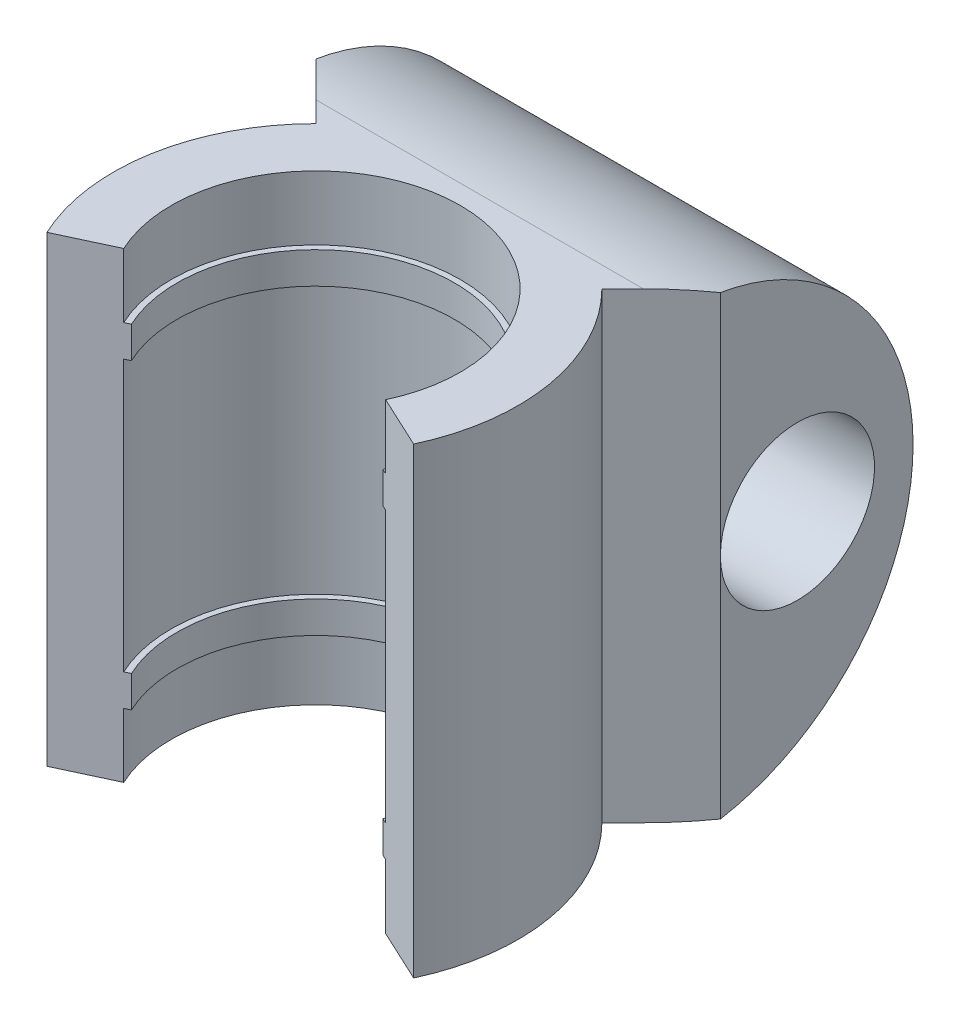
ISO-10303-21;
HEADER;
FILE_DESCRIPTION(('STEP AP214'),'2;1');
FILE_NAME('part.step','',(''),(''),'','','');
FILE_SCHEMA(('AUTOMOTIVE_DESIGN { 1 0 10303 214 1 1 1 1 }'));
ENDSEC;
DATA;
#1=APPLICATION_CONTEXT('core data for automotive mechanical design processes');
#2=APPLICATION_PROTOCOL_DEFINITION('international standard','automotive_design',2000,#1);
#3=PRODUCT_CONTEXT('',#1,'mechanical');
#4=PRODUCT('Part','Part','',(#3));
#5=PRODUCT_RELATED_PRODUCT_CATEGORY('part','',(#4));
#6=PRODUCT_DEFINITION_FORMATION('','',#4);
#7=PRODUCT_DEFINITION_CONTEXT('part definition',#1,'design');
#8=PRODUCT_DEFINITION('design','',#6,#7);
#9=PRODUCT_DEFINITION_SHAPE('','',#8);
#10=(LENGTH_UNIT() NAMED_UNIT(*) SI_UNIT(.MILLI.,.METRE.));
#11=(NAMED_UNIT(*) PLANE_ANGLE_UNIT() SI_UNIT($,.RADIAN.));
#12=(NAMED_UNIT(*) SI_UNIT($,.STERADIAN.) SOLID_ANGLE_UNIT());
#13=UNCERTAINTY_MEASURE_WITH_UNIT(LENGTH_MEASURE(1.E-05),#10,'distance_accuracy_value','');
#14=(GEOMETRIC_REPRESENTATION_CONTEXT(3) GLOBAL_UNCERTAINTY_ASSIGNED_CONTEXT((#13)) GLOBAL_UNIT_ASSIGNED_CONTEXT((#10,
#11,#12)) REPRESENTATION_CONTEXT('',''));
#15=CARTESIAN_POINT('',(0.,0.,0.));
#16=DIRECTION('',(0.,0.,1.));
#17=DIRECTION('',(1.,0.,0.));
#18=AXIS2_PLACEMENT_3D('',#15,#16,#17);
#19=CARTESIAN_POINT('',(0.,-542.901644973638,-1.86228782416426E-12));
#20=DIRECTION('',(0.,-1.,0.));
#21=DIRECTION('',(0.,0.,-1.));
#22=AXIS2_PLACEMENT_3D('',#19,#20,#21);
#23=CYLINDRICAL_SURFACE('',#22,10.5);
#24=CARTESIAN_POINT('',(0.,0.,0.));
#25=DIRECTION('',(0.,-1.,0.));
#26=DIRECTION('',(0.,0.,-1.));
#27=AXIS2_PLACEMENT_3D('',#24,#25,#26);
#28=CIRCLE('',#27,10.5);
#29=CARTESIAN_POINT('',(7.42462120245875,0.,-7.42462120245875));
#30=VERTEX_POINT('',#29);
#31=CARTESIAN_POINT('',(9.51623176388481,0.,4.43749174827739));
#32=VERTEX_POINT('',#31);
#33=EDGE_CURVE('E214',#30,#32,#28,.T.);
#34=ORIENTED_EDGE('',*,*,#33,.F.);
#35=DIRECTION('',(0.,1.,0.));
#36=VECTOR('',#35,1.);
#37=CARTESIAN_POINT('',(7.42462120245881,-24.737937074445,-7.42462120245889));
#38=LINE('',#37,#36);
#39=CARTESIAN_POINT('',(7.42462120245881,24.,-7.42462120245873));
#40=VERTEX_POINT('',#39);
#41=EDGE_CURVE('E206',#30,#40,#38,.T.);
#42=ORIENTED_EDGE('',*,*,#41,.T.);
#43=CARTESIAN_POINT('',(0.,23.9999999999999,0.));
#44=DIRECTION('',(0.,-1.,0.));
#45=DIRECTION('',(0.,0.,-1.));
#46=AXIS2_PLACEMENT_3D('',#43,#44,#45);
#47=CIRCLE('',#46,10.5000000000001);
#48=CARTESIAN_POINT('',(9.51623176388488,23.9999999999999,4.4374917482775));
#49=VERTEX_POINT('',#48);
#50=EDGE_CURVE('E213',#40,#49,#47,.T.);
#51=ORIENTED_EDGE('',*,*,#50,.T.);
#52=DIRECTION('',(0.,1.,0.));
#53=VECTOR('',#52,1.);
#54=CARTESIAN_POINT('',(9.51623176388481,0.,4.43749174827739));
#55=LINE('',#54,#53);
#56=EDGE_CURVE('E332',#32,#49,#55,.T.);
#57=ORIENTED_EDGE('',*,*,#56,.F.);
#58=EDGE_LOOP('',(#34,#42,#51,#57));
#59=FACE_BOUND('',#58,.T.);
#60=ADVANCED_FACE('F47',(#59),#23,.T.);
#61=CARTESIAN_POINT('',(0.,19.03,0.));
#62=DIRECTION('',(0.,1.,0.));
#63=DIRECTION('',(0.,0.,1.));
#64=AXIS2_PLACEMENT_3D('',#61,#62,#63);
#65=PLANE('',#64);
#66=CARTESIAN_POINT('',(0.,19.03,0.));
#67=DIRECTION('',(0.,-1.,0.));
#68=DIRECTION('',(0.,0.,-1.));
#69=AXIS2_PLACEMENT_3D('',#66,#67,#68);
#70=CIRCLE('',#69,7.20000000000007);
#71=CARTESIAN_POINT('',(-6.52541606666392,19.03,3.04285148453316));
#72=VERTEX_POINT('',#71);
#73=CARTESIAN_POINT('',(6.52541606666392,19.03,3.04285148453316));
#74=VERTEX_POINT('',#73);
#75=EDGE_CURVE('E233',#72,#74,#70,.T.);
#76=ORIENTED_EDGE('',*,*,#75,.F.);
#77=DIRECTION('',(0.906307787036648,0.,-0.422618261740703));
#78=VECTOR('',#77,1.);
#79=CARTESIAN_POINT('',(0.,19.03,0.));
#80=LINE('',#79,#78);
#81=CARTESIAN_POINT('',(-6.79730840277492,19.03,3.16963696305537));
#82=VERTEX_POINT('',#81);
#83=EDGE_CURVE('E352',#82,#72,#80,.T.);
#84=ORIENTED_EDGE('',*,*,#83,.F.);
#85=CARTESIAN_POINT('',(0.,19.03,0.));
#86=DIRECTION('',(0.,-1.,0.));
#87=DIRECTION('',(0.,0.,-1.));
#88=AXIS2_PLACEMENT_3D('',#85,#86,#87);
#89=CIRCLE('',#88,7.50000000000006);
#90=CARTESIAN_POINT('',(6.79730840277492,19.03,3.16963696305537));
#91=VERTEX_POINT('',#90);
#92=EDGE_CURVE('E397',#82,#91,#89,.T.);
#93=ORIENTED_EDGE('',*,*,#92,.T.);
#94=DIRECTION('',(-0.906307787036648,0.,-0.422618261740703));
#95=VECTOR('',#94,1.);
#96=CARTESIAN_POINT('',(0.,19.03,0.));
#97=LINE('',#96,#95);
#98=EDGE_CURVE('E304',#91,#74,#97,.T.);
#99=ORIENTED_EDGE('',*,*,#98,.T.);
#100=EDGE_LOOP('',(#76,#84,#93,#99));
#101=FACE_BOUND('',#100,.T.);
#102=ADVANCED_FACE('F447',(#101),#65,.F.);
#103=CARTESIAN_POINT('',(0.,-542.901644973638,-1.86228782416426E-12));
#104=DIRECTION('',(0.,-1.,0.));
#105=DIRECTION('',(0.,0.,-1.));
#106=AXIS2_PLACEMENT_3D('',#103,#104,#105);
#107=CYLINDRICAL_SURFACE('',#106,7.20000000000007);
#108=CARTESIAN_POINT('',(0.,20.67,0.));
#109=DIRECTION('',(0.,-1.,0.));
#110=DIRECTION('',(0.,0.,-1.));
#111=AXIS2_PLACEMENT_3D('',#108,#109,#110);
#112=CIRCLE('',#111,7.20000000000007);
#113=CARTESIAN_POINT('',(-6.52541606666393,20.67,3.04285148453316));
#114=VERTEX_POINT('',#113);
#115=CARTESIAN_POINT('',(6.52541606666393,20.67,3.04285148453316));
#116=VERTEX_POINT('',#115);
#117=EDGE_CURVE('E230',#114,#116,#112,.T.);
#118=ORIENTED_EDGE('',*,*,#117,.F.);
#119=DIRECTION('',(0.,-1.,0.));
#120=VECTOR('',#119,1.);
#121=CARTESIAN_POINT('',(-6.52541606666387,0.,3.04285148453306));
#122=LINE('',#121,#120);
#123=EDGE_CURVE('E393',#114,#72,#122,.T.);
#124=ORIENTED_EDGE('',*,*,#123,.T.);
#125=ORIENTED_EDGE('',*,*,#75,.T.);
#126=DIRECTION('',(0.,-1.,0.));
#127=VECTOR('',#126,1.);
#128=CARTESIAN_POINT('',(6.52541606666387,0.,3.04285148453306));
#129=LINE('',#128,#127);
#130=EDGE_CURVE('E348',#116,#74,#129,.T.);
#131=ORIENTED_EDGE('',*,*,#130,.F.);
#132=EDGE_LOOP('',(#118,#124,#125,#131));
#133=FACE_BOUND('',#132,.T.);
#134=ADVANCED_FACE('F445',(#133),#107,.F.);
#135=CARTESIAN_POINT('',(-2.80908414487774E-13,20.67,2.01892991722799E-13));
#136=DIRECTION('',(0.,1.,0.));
#137=DIRECTION('',(0.,0.,1.));
#138=AXIS2_PLACEMENT_3D('',#135,#136,#137);
#139=PLANE('',#138);
#140=CARTESIAN_POINT('',(0.,20.67,0.));
#141=DIRECTION('',(0.,-1.,0.));
#142=DIRECTION('',(0.,0.,-1.));
#143=AXIS2_PLACEMENT_3D('',#140,#141,#142);
#144=CIRCLE('',#143,7.50000000000007);
#145=CARTESIAN_POINT('',(-6.79730840277492,20.67,3.16963696305538));
#146=VERTEX_POINT('',#145);
#147=CARTESIAN_POINT('',(6.79730840277493,20.67,3.16963696305538));
#148=VERTEX_POINT('',#147);
#149=EDGE_CURVE('E227',#146,#148,#144,.T.);
#150=ORIENTED_EDGE('',*,*,#149,.F.);
#151=DIRECTION('',(0.906307787036648,0.,-0.422618261740703));
#152=VECTOR('',#151,1.);
#153=CARTESIAN_POINT('',(-2.80908414487774E-13,20.6700000000001,2.01892991722799E-13));
#154=LINE('',#153,#152);
#155=EDGE_CURVE('E389',#146,#114,#154,.T.);
#156=ORIENTED_EDGE('',*,*,#155,.T.);
#157=ORIENTED_EDGE('',*,*,#117,.T.);
#158=DIRECTION('',(-0.906307787036648,0.,-0.422618261740703));
#159=VECTOR('',#158,1.);
#160=CARTESIAN_POINT('',(2.80908414487774E-13,20.6700000000001,2.01892991722798E-13));
#161=LINE('',#160,#159);
#162=EDGE_CURVE('E344',#148,#116,#161,.T.);
#163=ORIENTED_EDGE('',*,*,#162,.F.);
#164=EDGE_LOOP('',(#150,#156,#157,#163));
#165=FACE_BOUND('',#164,.T.);
#166=ADVANCED_FACE('F442',(#165),#139,.T.);
#167=CARTESIAN_POINT('',(0.,-542.901644973638,-1.86228782416426E-12));
#168=DIRECTION('',(0.,-1.,0.));
#169=DIRECTION('',(0.,0.,-1.));
#170=AXIS2_PLACEMENT_3D('',#167,#168,#169);
#171=CYLINDRICAL_SURFACE('',#170,7.50000000000008);
#172=CARTESIAN_POINT('',(0.,23.9999999999999,0.));
#173=DIRECTION('',(0.,-1.,0.));
#174=DIRECTION('',(0.,0.,-1.));
#175=AXIS2_PLACEMENT_3D('',#172,#173,#174);
#176=CIRCLE('',#175,7.50000000000008);
#177=CARTESIAN_POINT('',(-6.79730840277494,24.,3.16963696305539));
#178=VERTEX_POINT('',#177);
#179=CARTESIAN_POINT('',(6.79730840277494,24.,3.16963696305539));
#180=VERTEX_POINT('',#179);
#181=EDGE_CURVE('E224',#178,#180,#176,.T.);
#182=ORIENTED_EDGE('',*,*,#181,.F.);
#183=DIRECTION('',(0.,-1.,0.));
#184=VECTOR('',#183,1.);
#185=CARTESIAN_POINT('',(-6.79730840277486,0.,3.16963696305528));
#186=LINE('',#185,#184);
#187=EDGE_CURVE('E385',#178,#146,#186,.T.);
#188=ORIENTED_EDGE('',*,*,#187,.T.);
#189=ORIENTED_EDGE('',*,*,#149,.T.);
#190=DIRECTION('',(0.,-1.,0.));
#191=VECTOR('',#190,1.);
#192=CARTESIAN_POINT('',(6.79730840277486,0.,3.16963696305527));
#193=LINE('',#192,#191);
#194=EDGE_CURVE('E340',#180,#148,#193,.T.);
#195=ORIENTED_EDGE('',*,*,#194,.F.);
#196=EDGE_LOOP('',(#182,#188,#189,#195));
#197=FACE_BOUND('',#196,.T.);
#198=ADVANCED_FACE('F437',(#197),#171,.F.);
#199=CARTESIAN_POINT('',(0.,24.,1.17118436835184E-13));
#200=DIRECTION('',(0.,-1.,0.));
#201=DIRECTION('',(0.,0.,-1.));
#202=AXIS2_PLACEMENT_3D('',#199,#200,#201);
#203=PLANE('',#202);
#204=DIRECTION('',(-0.707106781186547,0.,0.707106781186548));
#205=VECTOR('',#204,1.);
#206=CARTESIAN_POINT('',(0.,24.,0.));
#207=LINE('',#206,#205);
#208=CARTESIAN_POINT('',(8.50000000000009,24.,-8.5));
#209=VERTEX_POINT('',#208);
#210=EDGE_CURVE('E288',#209,#40,#207,.T.);
#211=ORIENTED_EDGE('',*,*,#210,.F.);
#212=DIRECTION('',(-1.,0.,0.));
#213=VECTOR('',#212,1.);
#214=CARTESIAN_POINT('',(-10.5000000000001,24.,-8.5));
#215=LINE('',#214,#213);
#216=CARTESIAN_POINT('',(-8.50000000000009,24.,-8.50000000000001));
#217=VERTEX_POINT('',#216);
#218=EDGE_CURVE('E11',#209,#217,#215,.T.);
#219=ORIENTED_EDGE('',*,*,#218,.T.);
#220=DIRECTION('',(0.707106781186547,0.,0.707106781186548));
#221=VECTOR('',#220,1.);
#222=CARTESIAN_POINT('',(0.,24.,0.));
#223=LINE('',#222,#221);
#224=CARTESIAN_POINT('',(-7.42462120245881,24.,-7.42462120245873));
#225=VERTEX_POINT('',#224);
#226=EDGE_CURVE('E197',#217,#225,#223,.T.);
#227=ORIENTED_EDGE('',*,*,#226,.T.);
#228=CARTESIAN_POINT('',(-9.51623176388488,23.9999999999999,4.4374917482775));
#229=VERTEX_POINT('',#228);
#230=EDGE_CURVE('E204',#229,#225,#47,.T.);
#231=ORIENTED_EDGE('',*,*,#230,.F.);
#232=DIRECTION('',(-0.906307787036648,0.,0.422618261740703));
#233=VECTOR('',#232,1.);
#234=CARTESIAN_POINT('',(0.,24.,1.17118436835184E-13));
#235=LINE('',#234,#233);
#236=EDGE_CURVE('E381',#178,#229,#235,.T.);
#237=ORIENTED_EDGE('',*,*,#236,.F.);
#238=ORIENTED_EDGE('',*,*,#181,.T.);
#239=DIRECTION('',(0.906307787036648,0.,0.422618261740703));
#240=VECTOR('',#239,1.);
#241=CARTESIAN_POINT('',(0.,24.,1.17118436835184E-13));
#242=LINE('',#241,#240);
#243=EDGE_CURVE('E336',#180,#49,#242,.T.);
#244=ORIENTED_EDGE('',*,*,#243,.T.);
#245=ORIENTED_EDGE('',*,*,#50,.F.);
#246=EDGE_LOOP('',(#211,#219,#227,#231,#237,#238,#244,#245));
#247=FACE_BOUND('',#246,.T.);
#248=ADVANCED_FACE('F433',(#247),#203,.F.);
#249=DIRECTION('',(0.,1.,0.));
#250=VECTOR('',#249,1.);
#251=CARTESIAN_POINT('',(-7.42462120245881,-24.737937074445,-7.42462120245889));
#252=LINE('',#251,#250);
#253=CARTESIAN_POINT('',(-7.42462120245881,0.,-7.42462120245881));
#254=VERTEX_POINT('',#253);
#255=EDGE_CURVE('E188',#254,#225,#252,.T.);
#256=ORIENTED_EDGE('',*,*,#255,.F.);
#257=CARTESIAN_POINT('',(-9.51623176388481,0.,4.43749174827739));
#258=VERTEX_POINT('',#257);
#259=EDGE_CURVE('E202',#258,#254,#28,.T.);
#260=ORIENTED_EDGE('',*,*,#259,.F.);
#261=DIRECTION('',(0.,1.,0.));
#262=VECTOR('',#261,1.);
#263=CARTESIAN_POINT('',(-9.51623176388481,0.,4.43749174827739));
#264=LINE('',#263,#262);
#265=EDGE_CURVE('E378',#258,#229,#264,.T.);
#266=ORIENTED_EDGE('',*,*,#265,.T.);
#267=ORIENTED_EDGE('',*,*,#230,.T.);
#268=EDGE_LOOP('',(#256,#260,#266,#267));
#269=FACE_BOUND('',#268,.T.);
#270=ADVANCED_FACE('F200',(#269),#23,.T.);
#271=CARTESIAN_POINT('',(0.,0.,0.));
#272=DIRECTION('',(0.,-1.,0.));
#273=DIRECTION('',(0.,0.,-1.));
#274=AXIS2_PLACEMENT_3D('',#271,#272,#273);
#275=PLANE('',#274);
#276=DIRECTION('',(0.707106781186547,0.,0.707106781186548));
#277=VECTOR('',#276,1.);
#278=CARTESIAN_POINT('',(0.,0.,0.));
#279=LINE('',#278,#277);
#280=CARTESIAN_POINT('',(-8.50000000000009,0.,-8.50000000000009));
#281=VERTEX_POINT('',#280);
#282=EDGE_CURVE('E183',#281,#254,#279,.T.);
#283=ORIENTED_EDGE('',*,*,#282,.F.);
#284=DIRECTION('',(-1.,0.,0.));
#285=VECTOR('',#284,1.);
#286=CARTESIAN_POINT('',(0.,0.,-8.50000000000009));
#287=LINE('',#286,#285);
#288=CARTESIAN_POINT('',(8.50000000000009,0.,-8.50000000000009));
#289=VERTEX_POINT('',#288);
#290=EDGE_CURVE('E248',#281,#289,#287,.F.);
#291=ORIENTED_EDGE('',*,*,#290,.T.);
#292=DIRECTION('',(-0.707106781186547,0.,0.707106781186548));
#293=VECTOR('',#292,1.);
#294=CARTESIAN_POINT('',(0.,0.,0.));
#295=LINE('',#294,#293);
#296=EDGE_CURVE('E280',#289,#30,#295,.T.);
#297=ORIENTED_EDGE('',*,*,#296,.T.);
#298=ORIENTED_EDGE('',*,*,#33,.T.);
#299=DIRECTION('',(0.906307787036648,0.,0.422618261740703));
#300=VECTOR('',#299,1.);
#301=CARTESIAN_POINT('',(0.,0.,0.));
#302=LINE('',#301,#300);
#303=CARTESIAN_POINT('',(6.79730840277486,0.,3.16963696305528));
#304=VERTEX_POINT('',#303);
#305=EDGE_CURVE('E328',#304,#32,#302,.T.);
#306=ORIENTED_EDGE('',*,*,#305,.F.);
#307=CARTESIAN_POINT('',(0.,0.,0.));
#308=DIRECTION('',(0.,-1.,0.));
#309=DIRECTION('',(0.,0.,-1.));
#310=AXIS2_PLACEMENT_3D('',#307,#308,#309);
#311=CIRCLE('',#310,7.5);
#312=CARTESIAN_POINT('',(-6.79730840277486,0.,3.16963696305528));
#313=VERTEX_POINT('',#312);
#314=EDGE_CURVE('E219',#313,#304,#311,.T.);
#315=ORIENTED_EDGE('',*,*,#314,.F.);
#316=DIRECTION('',(-0.906307787036648,0.,0.422618261740703));
#317=VECTOR('',#316,1.);
#318=CARTESIAN_POINT('',(0.,0.,0.));
#319=LINE('',#318,#317);
#320=EDGE_CURVE('E210',#313,#258,#319,.T.);
#321=ORIENTED_EDGE('',*,*,#320,.T.);
#322=ORIENTED_EDGE('',*,*,#259,.T.);
#323=EDGE_LOOP('',(#283,#291,#297,#298,#306,#315,#321,#322));
#324=FACE_BOUND('',#323,.T.);
#325=ADVANCED_FACE('F208',(#324),#275,.T.);
#326=CARTESIAN_POINT('',(0.,-542.901644973638,-1.86228782416426E-12));
#327=DIRECTION('',(0.,-1.,0.));
#328=DIRECTION('',(0.,0.,-1.));
#329=AXIS2_PLACEMENT_3D('',#326,#327,#328);
#330=CYLINDRICAL_SURFACE('',#329,7.50000000000001);
#331=CARTESIAN_POINT('',(0.,3.32999999999994,0.));
#332=DIRECTION('',(0.,-1.,0.));
#333=DIRECTION('',(0.,0.,-1.));
#334=AXIS2_PLACEMENT_3D('',#331,#332,#333);
#335=CIRCLE('',#334,7.50000000000001);
#336=CARTESIAN_POINT('',(-6.79730840277487,3.32999999999996,3.16963696305529));
#337=VERTEX_POINT('',#336);
#338=CARTESIAN_POINT('',(6.79730840277487,3.32999999999996,3.16963696305529));
#339=VERTEX_POINT('',#338);
#340=EDGE_CURVE('E408',#337,#339,#335,.T.);
#341=ORIENTED_EDGE('',*,*,#340,.F.);
#342=DIRECTION('',(0.,-1.,0.));
#343=VECTOR('',#342,1.);
#344=CARTESIAN_POINT('',(-6.79730840277486,0.,3.16963696305528));
#345=LINE('',#344,#343);
#346=EDGE_CURVE('E372',#337,#313,#345,.T.);
#347=ORIENTED_EDGE('',*,*,#346,.T.);
#348=ORIENTED_EDGE('',*,*,#314,.T.);
#349=DIRECTION('',(0.,-1.,0.));
#350=VECTOR('',#349,1.);
#351=CARTESIAN_POINT('',(6.79730840277486,0.,3.16963696305528));
#352=LINE('',#351,#350);
#353=EDGE_CURVE('E324',#339,#304,#352,.T.);
#354=ORIENTED_EDGE('',*,*,#353,.F.);
#355=EDGE_LOOP('',(#341,#347,#348,#354));
#356=FACE_BOUND('',#355,.T.);
#357=ADVANCED_FACE('F416',(#356),#330,.F.);
#358=CARTESIAN_POINT('',(0.,3.32999999999997,0.));
#359=DIRECTION('',(0.,1.,0.));
#360=DIRECTION('',(0.,0.,1.));
#361=AXIS2_PLACEMENT_3D('',#358,#359,#360);
#362=PLANE('',#361);
#363=CARTESIAN_POINT('',(0.,3.32999999999994,0.));
#364=DIRECTION('',(0.,-1.,0.));
#365=DIRECTION('',(0.,0.,-1.));
#366=AXIS2_PLACEMENT_3D('',#363,#364,#365);
#367=CIRCLE('',#366,7.20000000000001);
#368=CARTESIAN_POINT('',(-6.52541606666388,3.32999999999996,3.04285148453308));
#369=VERTEX_POINT('',#368);
#370=CARTESIAN_POINT('',(6.52541606666388,3.32999999999996,3.04285148453308));
#371=VERTEX_POINT('',#370);
#372=EDGE_CURVE('E406',#369,#371,#367,.T.);
#373=ORIENTED_EDGE('',*,*,#372,.F.);
#374=DIRECTION('',(0.906307787036648,0.,-0.422618261740703));
#375=VECTOR('',#374,1.);
#376=CARTESIAN_POINT('',(0.,3.33,0.));
#377=LINE('',#376,#375);
#378=EDGE_CURVE('E368',#337,#369,#377,.T.);
#379=ORIENTED_EDGE('',*,*,#378,.F.);
#380=ORIENTED_EDGE('',*,*,#340,.T.);
#381=DIRECTION('',(-0.906307787036648,0.,-0.422618261740703));
#382=VECTOR('',#381,1.);
#383=CARTESIAN_POINT('',(0.,3.33,0.));
#384=LINE('',#383,#382);
#385=EDGE_CURVE('E320',#339,#371,#384,.T.);
#386=ORIENTED_EDGE('',*,*,#385,.T.);
#387=EDGE_LOOP('',(#373,#379,#380,#386));
#388=FACE_BOUND('',#387,.T.);
#389=ADVANCED_FACE('F460',(#388),#362,.F.);
#390=CARTESIAN_POINT('',(0.,-542.901644973638,-1.86228782416426E-12));
#391=DIRECTION('',(0.,-1.,0.));
#392=DIRECTION('',(0.,0.,-1.));
#393=AXIS2_PLACEMENT_3D('',#390,#391,#392);
#394=CYLINDRICAL_SURFACE('',#393,7.20000000000002);
#395=CARTESIAN_POINT('',(0.,4.96999999999992,0.));
#396=DIRECTION('',(0.,-1.,0.));
#397=DIRECTION('',(0.,0.,-1.));
#398=AXIS2_PLACEMENT_3D('',#395,#396,#397);
#399=CIRCLE('',#398,7.20000000000002);
#400=CARTESIAN_POINT('',(-6.52541606666388,4.96999999999996,3.04285148453309));
#401=VERTEX_POINT('',#400);
#402=CARTESIAN_POINT('',(6.52541606666388,4.96999999999996,3.04285148453309));
#403=VERTEX_POINT('',#402);
#404=EDGE_CURVE('E403',#401,#403,#399,.T.);
#405=ORIENTED_EDGE('',*,*,#404,.F.);
#406=DIRECTION('',(0.,1.,0.));
#407=VECTOR('',#406,1.);
#408=CARTESIAN_POINT('',(-6.52541606666387,0.,3.04285148453306));
#409=LINE('',#408,#407);
#410=EDGE_CURVE('E364',#369,#401,#409,.T.);
#411=ORIENTED_EDGE('',*,*,#410,.F.);
#412=ORIENTED_EDGE('',*,*,#372,.T.);
#413=DIRECTION('',(0.,1.,0.));
#414=VECTOR('',#413,1.);
#415=CARTESIAN_POINT('',(6.52541606666387,0.,3.04285148453306));
#416=LINE('',#415,#414);
#417=EDGE_CURVE('E316',#371,#403,#416,.T.);
#418=ORIENTED_EDGE('',*,*,#417,.T.);
#419=EDGE_LOOP('',(#405,#411,#412,#418));
#420=FACE_BOUND('',#419,.T.);
#421=ADVANCED_FACE('F459',(#420),#394,.F.);
#422=CARTESIAN_POINT('',(0.,4.96999999999997,0.));
#423=DIRECTION('',(0.,1.,0.));
#424=DIRECTION('',(0.,0.,1.));
#425=AXIS2_PLACEMENT_3D('',#422,#423,#424);
#426=PLANE('',#425);
#427=CARTESIAN_POINT('',(0.,4.96999999999992,0.));
#428=DIRECTION('',(0.,-1.,0.));
#429=DIRECTION('',(0.,0.,-1.));
#430=AXIS2_PLACEMENT_3D('',#427,#428,#429);
#431=CIRCLE('',#430,7.50000000000002);
#432=CARTESIAN_POINT('',(-6.79730840277488,4.96999999999996,3.1696369630553));
#433=VERTEX_POINT('',#432);
#434=CARTESIAN_POINT('',(6.79730840277488,4.96999999999996,3.1696369630553));
#435=VERTEX_POINT('',#434);
#436=EDGE_CURVE('E400',#433,#435,#431,.T.);
#437=ORIENTED_EDGE('',*,*,#436,.F.);
#438=DIRECTION('',(0.906307787036648,0.,-0.422618261740703));
#439=VECTOR('',#438,1.);
#440=CARTESIAN_POINT('',(0.,4.97,0.));
#441=LINE('',#440,#439);
#442=EDGE_CURVE('E360',#433,#401,#441,.T.);
#443=ORIENTED_EDGE('',*,*,#442,.T.);
#444=ORIENTED_EDGE('',*,*,#404,.T.);
#445=DIRECTION('',(-0.906307787036648,0.,-0.422618261740703));
#446=VECTOR('',#445,1.);
#447=CARTESIAN_POINT('',(0.,4.97,0.));
#448=LINE('',#447,#446);
#449=EDGE_CURVE('E312',#435,#403,#448,.T.);
#450=ORIENTED_EDGE('',*,*,#449,.F.);
#451=EDGE_LOOP('',(#437,#443,#444,#450));
#452=FACE_BOUND('',#451,.T.);
#453=ADVANCED_FACE('F455',(#452),#426,.T.);
#454=CARTESIAN_POINT('',(0.,-542.901644973638,-1.86228782416426E-12));
#455=DIRECTION('',(0.,-1.,0.));
#456=DIRECTION('',(0.,0.,-1.));
#457=AXIS2_PLACEMENT_3D('',#454,#455,#456);
#458=CYLINDRICAL_SURFACE('',#457,7.50000000000004);
#459=DIRECTION('',(0.,-1.,0.));
#460=VECTOR('',#459,1.);
#461=CARTESIAN_POINT('',(-6.79730840277486,0.,3.16963696305528));
#462=LINE('',#461,#460);
#463=EDGE_CURVE('E356',#82,#433,#462,.T.);
#464=ORIENTED_EDGE('',*,*,#463,.T.);
#465=ORIENTED_EDGE('',*,*,#436,.T.);
#466=DIRECTION('',(0.,-1.,0.));
#467=VECTOR('',#466,1.);
#468=CARTESIAN_POINT('',(6.79730840277486,0.,3.16963696305528));
#469=LINE('',#468,#467);
#470=EDGE_CURVE('E308',#91,#435,#469,.T.);
#471=ORIENTED_EDGE('',*,*,#470,.F.);
#472=ORIENTED_EDGE('',*,*,#92,.F.);
#473=EDGE_LOOP('',(#464,#465,#471,#472));
#474=FACE_BOUND('',#473,.T.);
#475=ADVANCED_FACE('F452',(#474),#458,.F.);
#476=CARTESIAN_POINT('',(0.,0.,0.));
#477=DIRECTION('',(-0.422618261740703,0.,-0.906307787036648));
#478=DIRECTION('',(-0.906307787036648,0.,0.422618261740703));
#479=AXIS2_PLACEMENT_3D('',#476,#477,#478);
#480=PLANE('',#479);
#481=ORIENTED_EDGE('',*,*,#83,.T.);
#482=ORIENTED_EDGE('',*,*,#123,.F.);
#483=ORIENTED_EDGE('',*,*,#155,.F.);
#484=ORIENTED_EDGE('',*,*,#187,.F.);
#485=ORIENTED_EDGE('',*,*,#236,.T.);
#486=ORIENTED_EDGE('',*,*,#265,.F.);
#487=ORIENTED_EDGE('',*,*,#320,.F.);
#488=ORIENTED_EDGE('',*,*,#346,.F.);
#489=ORIENTED_EDGE('',*,*,#378,.T.);
#490=ORIENTED_EDGE('',*,*,#410,.T.);
#491=ORIENTED_EDGE('',*,*,#442,.F.);
#492=ORIENTED_EDGE('',*,*,#463,.F.);
#493=EDGE_LOOP('',(#481,#482,#483,#484,#485,#486,#487,#488,#489,#490,#491,#492));
#494=FACE_BOUND('',#493,.T.);
#495=ADVANCED_FACE('F462',(#494),#480,.F.);
#496=CARTESIAN_POINT('',(0.,0.,0.));
#497=DIRECTION('',(-0.422618261740703,0.,0.906307787036648));
#498=DIRECTION('',(0.906307787036648,0.,0.422618261740703));
#499=AXIS2_PLACEMENT_3D('',#496,#497,#498);
#500=PLANE('',#499);
#501=ORIENTED_EDGE('',*,*,#98,.F.);
#502=ORIENTED_EDGE('',*,*,#470,.T.);
#503=ORIENTED_EDGE('',*,*,#449,.T.);
#504=ORIENTED_EDGE('',*,*,#417,.F.);
#505=ORIENTED_EDGE('',*,*,#385,.F.);
#506=ORIENTED_EDGE('',*,*,#353,.T.);
#507=ORIENTED_EDGE('',*,*,#305,.T.);
#508=ORIENTED_EDGE('',*,*,#56,.T.);
#509=ORIENTED_EDGE('',*,*,#243,.F.);
#510=ORIENTED_EDGE('',*,*,#194,.T.);
#511=ORIENTED_EDGE('',*,*,#162,.T.);
#512=ORIENTED_EDGE('',*,*,#130,.T.);
#513=EDGE_LOOP('',(#501,#502,#503,#504,#505,#506,#507,#508,#509,#510,#511,#512));
#514=FACE_BOUND('',#513,.T.);
#515=ADVANCED_FACE('F421',(#514),#500,.T.);
#516=CARTESIAN_POINT('',(0.,-24.737937074445,0.));
#517=DIRECTION('',(-0.707106781186548,0.,0.707106781186547));
#518=DIRECTION('',(0.707106781186547,0.,0.707106781186548));
#519=AXIS2_PLACEMENT_3D('',#516,#517,#518);
#520=PLANE('',#519);
#521=DIRECTION('',(0.,1.,0.));
#522=VECTOR('',#521,1.);
#523=CARTESIAN_POINT('',(-10.5000000000001,-24.737937074445,-10.5000000000002));
#524=LINE('',#523,#522);
#525=CARTESIAN_POINT('',(-10.5000000000001,0.167840433800751,-10.5000000000001));
#526=VERTEX_POINT('',#525);
#527=CARTESIAN_POINT('',(-10.5000000000001,12.,-10.5));
#528=VERTEX_POINT('',#527);
#529=EDGE_CURVE('E300',#526,#528,#524,.T.);
#530=ORIENTED_EDGE('',*,*,#529,.F.);
#531=CARTESIAN_POINT('',(-8.50000000000008,12.,-8.50000000000005));
#532=DIRECTION('',(-0.707106781186548,0.,0.707106781186547));
#533=DIRECTION('',(-0.707106781186547,0.,-0.707106781186548));
#534=AXIS2_PLACEMENT_3D('',#531,#532,#533);
#535=ELLIPSE('',#534,16.9705627484771,12.);
#536=EDGE_CURVE('E191',#526,#281,#535,.T.);
#537=ORIENTED_EDGE('',*,*,#536,.T.);
#538=ORIENTED_EDGE('',*,*,#282,.T.);
#539=ORIENTED_EDGE('',*,*,#255,.T.);
#540=ORIENTED_EDGE('',*,*,#226,.F.);
#541=CARTESIAN_POINT('',(-8.50000000000008,12.,-8.50000000000005));
#542=DIRECTION('',(-0.707106781186548,0.,0.707106781186547));
#543=DIRECTION('',(0.707106781186547,0.,0.707106781186548));
#544=AXIS2_PLACEMENT_3D('',#541,#542,#543);
#545=ELLIPSE('',#544,16.9705627484771,12.);
#546=CARTESIAN_POINT('',(-10.5000000000001,23.8321595661992,-10.5));
#547=VERTEX_POINT('',#546);
#548=EDGE_CURVE('E242',#217,#547,#545,.T.);
#549=ORIENTED_EDGE('',*,*,#548,.T.);
#550=EDGE_CURVE('E291',#528,#547,#524,.T.);
#551=ORIENTED_EDGE('',*,*,#550,.F.);
#552=EDGE_LOOP('',(#530,#537,#538,#539,#540,#549,#551));
#553=FACE_BOUND('',#552,.T.);
#554=ADVANCED_FACE('F186',(#553),#520,.T.);
#555=CARTESIAN_POINT('',(0.,-24.737937074445,0.));
#556=DIRECTION('',(-0.707106781186548,0.,-0.707106781186547));
#557=DIRECTION('',(-0.707106781186547,0.,0.707106781186548));
#558=AXIS2_PLACEMENT_3D('',#555,#556,#557);
#559=PLANE('',#558);
#560=ORIENTED_EDGE('',*,*,#296,.F.);
#561=CARTESIAN_POINT('',(8.50000000000009,12.,-8.50000000000005));
#562=DIRECTION('',(-0.707106781186548,0.,-0.707106781186547));
#563=DIRECTION('',(-0.707106781186547,0.,0.707106781186548));
#564=AXIS2_PLACEMENT_3D('',#561,#562,#563);
#565=ELLIPSE('',#564,16.9705627484771,12.);
#566=CARTESIAN_POINT('',(10.5000000000001,0.167840433800772,-10.5000000000001));
#567=VERTEX_POINT('',#566);
#568=EDGE_CURVE('E254',#289,#567,#565,.F.);
#569=ORIENTED_EDGE('',*,*,#568,.T.);
#570=DIRECTION('',(0.,1.,0.));
#571=VECTOR('',#570,1.);
#572=CARTESIAN_POINT('',(10.5000000000001,-24.737937074445,-10.5000000000002));
#573=LINE('',#572,#571);
#574=CARTESIAN_POINT('',(10.5000000000001,12.,-10.5));
#575=VERTEX_POINT('',#574);
#576=EDGE_CURVE('E270',#567,#575,#573,.T.);
#577=ORIENTED_EDGE('',*,*,#576,.T.);
#578=CARTESIAN_POINT('',(10.5000000000001,23.8321595661992,-10.5));
#579=VERTEX_POINT('',#578);
#580=EDGE_CURVE('E296',#575,#579,#573,.T.);
#581=ORIENTED_EDGE('',*,*,#580,.T.);
#582=CARTESIAN_POINT('',(8.50000000000009,12.,-8.50000000000005));
#583=DIRECTION('',(-0.707106781186548,0.,-0.707106781186547));
#584=DIRECTION('',(0.707106781186547,0.,-0.707106781186548));
#585=AXIS2_PLACEMENT_3D('',#582,#583,#584);
#586=ELLIPSE('',#585,16.9705627484771,12.);
#587=EDGE_CURVE('E251',#579,#209,#586,.F.);
#588=ORIENTED_EDGE('',*,*,#587,.T.);
#589=ORIENTED_EDGE('',*,*,#210,.T.);
#590=ORIENTED_EDGE('',*,*,#41,.F.);
#591=EDGE_LOOP('',(#560,#569,#577,#581,#588,#589,#590));
#592=FACE_BOUND('',#591,.T.);
#593=ADVANCED_FACE('F509',(#592),#559,.F.);
#594=CARTESIAN_POINT('',(10.5000000000001,-24.737937074445,0.));
#595=DIRECTION('',(1.,0.,0.));
#596=DIRECTION('',(0.,0.,-1.));
#597=AXIS2_PLACEMENT_3D('',#594,#595,#596);
#598=PLANE('',#597);
#599=ORIENTED_EDGE('',*,*,#580,.F.);
#600=CARTESIAN_POINT('',(10.5000000000001,12.,-14.5000000000001));
#601=DIRECTION('',(-1.,0.,0.));
#602=DIRECTION('',(0.,0.,1.));
#603=AXIS2_PLACEMENT_3D('',#600,#601,#602);
#604=CIRCLE('',#603,4.);
#605=EDGE_CURVE('E62',#575,#575,#604,.T.);
#606=ORIENTED_EDGE('',*,*,#605,.T.);
#607=ORIENTED_EDGE('',*,*,#576,.F.);
#608=CARTESIAN_POINT('',(10.5000000000001,12.,-8.50000000000005));
#609=DIRECTION('',(1.,0.,0.));
#610=DIRECTION('',(0.,0.,-1.));
#611=AXIS2_PLACEMENT_3D('',#608,#609,#610);
#612=CIRCLE('',#611,12.);
#613=CARTESIAN_POINT('',(10.5000000000001,12.,-20.5));
#614=VERTEX_POINT('',#613);
#615=EDGE_CURVE('E57',#567,#614,#612,.T.);
#616=ORIENTED_EDGE('',*,*,#615,.T.);
#617=CARTESIAN_POINT('',(10.5000000000001,12.,-8.50000000000005));
#618=DIRECTION('',(1.,0.,0.));
#619=DIRECTION('',(0.,0.,-1.));
#620=AXIS2_PLACEMENT_3D('',#617,#618,#619);
#621=CIRCLE('',#620,12.);
#622=EDGE_CURVE('E257',#614,#579,#621,.T.);
#623=ORIENTED_EDGE('',*,*,#622,.T.);
#624=EDGE_LOOP('',(#599,#606,#607,#616,#623));
#625=FACE_BOUND('',#624,.T.);
#626=ADVANCED_FACE('F267',(#625),#598,.T.);
#627=CARTESIAN_POINT('',(-10.5000000000001,-24.737937074445,0.));
#628=DIRECTION('',(-1.,0.,0.));
#629=DIRECTION('',(0.,0.,1.));
#630=AXIS2_PLACEMENT_3D('',#627,#628,#629);
#631=PLANE('',#630);
#632=ORIENTED_EDGE('',*,*,#529,.T.);
#633=CARTESIAN_POINT('',(-10.5000000000001,12.,-14.5000000000001));
#634=DIRECTION('',(-1.,0.,0.));
#635=DIRECTION('',(0.,0.,1.));
#636=AXIS2_PLACEMENT_3D('',#633,#634,#635);
#637=CIRCLE('',#636,4.);
#638=EDGE_CURVE('E67',#528,#528,#637,.T.);
#639=ORIENTED_EDGE('',*,*,#638,.F.);
#640=ORIENTED_EDGE('',*,*,#550,.T.);
#641=CARTESIAN_POINT('',(-10.5000000000001,12.,-8.50000000000005));
#642=DIRECTION('',(-1.,0.,0.));
#643=DIRECTION('',(0.,0.,1.));
#644=AXIS2_PLACEMENT_3D('',#641,#642,#643);
#645=CIRCLE('',#644,12.);
#646=CARTESIAN_POINT('',(-10.5000000000001,12.,-20.5));
#647=VERTEX_POINT('',#646);
#648=EDGE_CURVE('E236',#547,#647,#645,.T.);
#649=ORIENTED_EDGE('',*,*,#648,.T.);
#650=CARTESIAN_POINT('',(-10.5000000000001,12.,-8.50000000000005));
#651=DIRECTION('',(-1.,0.,0.));
#652=DIRECTION('',(0.,0.,1.));
#653=AXIS2_PLACEMENT_3D('',#650,#651,#652);
#654=CIRCLE('',#653,12.);
#655=EDGE_CURVE('E239',#647,#526,#654,.T.);
#656=ORIENTED_EDGE('',*,*,#655,.T.);
#657=EDGE_LOOP('',(#632,#639,#640,#649,#656));
#658=FACE_BOUND('',#657,.T.);
#659=ADVANCED_FACE('F500',(#658),#631,.T.);
#660=CARTESIAN_POINT('',(0.,12.,-8.50000000000005));
#661=DIRECTION('',(1.,0.,0.));
#662=DIRECTION('',(0.,0.,-1.));
#663=AXIS2_PLACEMENT_3D('',#660,#661,#662);
#664=CYLINDRICAL_SURFACE('',#663,12.);
#665=ORIENTED_EDGE('',*,*,#587,.F.);
#666=ORIENTED_EDGE('',*,*,#622,.F.);
#667=DIRECTION('',(-1.,0.,0.));
#668=VECTOR('',#667,1.);
#669=CARTESIAN_POINT('',(10.5000000000001,12.,-20.5));
#670=LINE('',#669,#668);
#671=EDGE_CURVE('E51',#647,#614,#670,.F.);
#672=ORIENTED_EDGE('',*,*,#671,.F.);
#673=ORIENTED_EDGE('',*,*,#648,.F.);
#674=ORIENTED_EDGE('',*,*,#548,.F.);
#675=ORIENTED_EDGE('',*,*,#218,.F.);
#676=EDGE_LOOP('',(#665,#666,#672,#673,#674,#675));
#677=FACE_BOUND('',#676,.T.);
#678=ADVANCED_FACE('F49',(#677),#664,.T.);
#679=CARTESIAN_POINT('',(0.,12.,-8.50000000000005));
#680=DIRECTION('',(-1.,0.,0.));
#681=DIRECTION('',(0.,0.,1.));
#682=AXIS2_PLACEMENT_3D('',#679,#680,#681);
#683=CYLINDRICAL_SURFACE('',#682,12.);
#684=ORIENTED_EDGE('',*,*,#568,.F.);
#685=ORIENTED_EDGE('',*,*,#290,.F.);
#686=ORIENTED_EDGE('',*,*,#536,.F.);
#687=ORIENTED_EDGE('',*,*,#655,.F.);
#688=ORIENTED_EDGE('',*,*,#671,.T.);
#689=ORIENTED_EDGE('',*,*,#615,.F.);
#690=EDGE_LOOP('',(#684,#685,#686,#687,#688,#689));
#691=FACE_BOUND('',#690,.T.);
#692=ADVANCED_FACE('F278',(#691),#683,.T.);
#693=CARTESIAN_POINT('',(10.5000000000001,12.,-14.5000000000001));
#694=DIRECTION('',(-1.,0.,0.));
#695=DIRECTION('',(0.,0.,1.));
#696=AXIS2_PLACEMENT_3D('',#693,#694,#695);
#697=CYLINDRICAL_SURFACE('',#696,4.);
#698=ORIENTED_EDGE('',*,*,#605,.F.);
#699=EDGE_LOOP('',(#698));
#700=FACE_BOUND('',#699,.T.);
#701=ORIENTED_EDGE('',*,*,#638,.T.);
#702=EDGE_LOOP('',(#701));
#703=FACE_BOUND('',#702,.T.);
#704=ADVANCED_FACE('F493',(#700,#703),#697,.F.);
#705=CLOSED_SHELL('',(#60,#102,#134,#166,#198,#248,#270,#325,#357,#389,#421,#453,#475,#495,#515,
#554,#593,#626,#659,#678,#692,#704));
#706=MANIFOLD_SOLID_BREP('B2',#705);
#707=ADVANCED_BREP_SHAPE_REPRESENTATION('',(#18,#706),#14);
#708=SHAPE_DEFINITION_REPRESENTATION(#9,#707);
ENDSEC;
END-ISO-10303-21;
